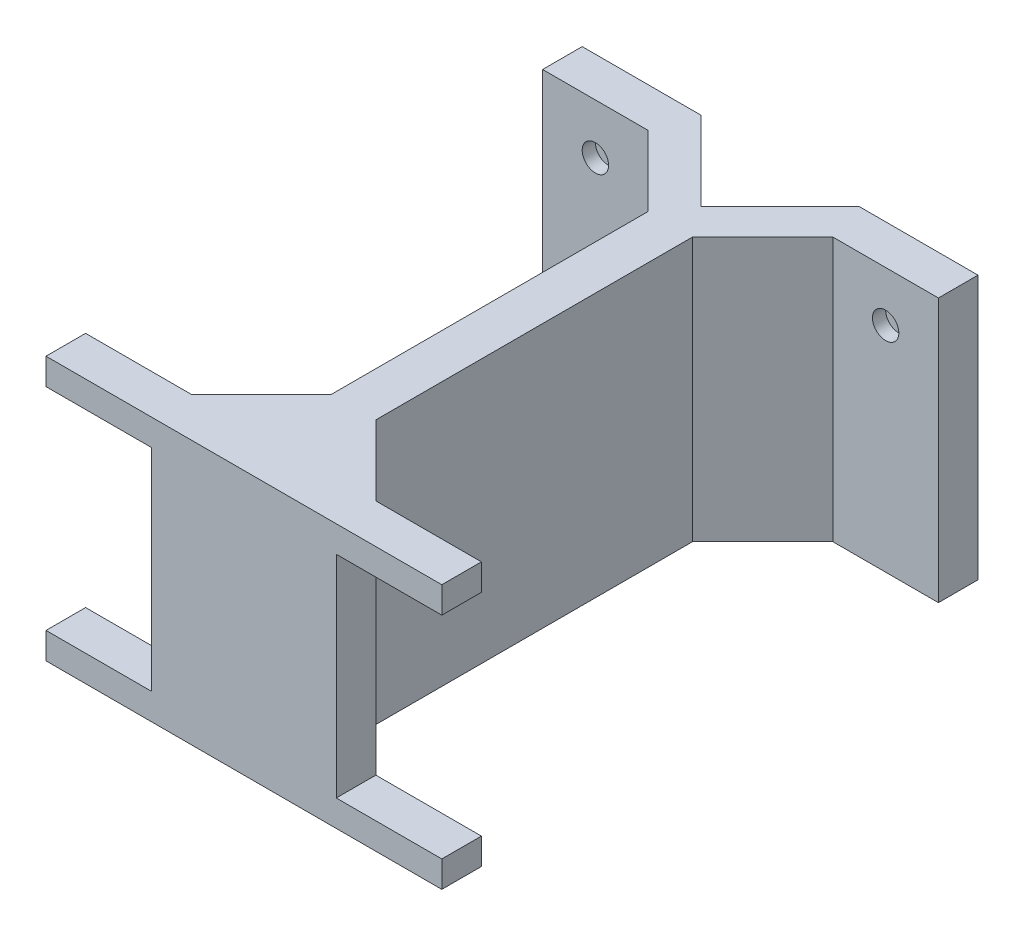
ISO-10303-21;
HEADER;
FILE_DESCRIPTION(('STEP AP214'),'2;1');
FILE_NAME('part.step','',(''),(''),'','','');
FILE_SCHEMA(('AUTOMOTIVE_DESIGN { 1 0 10303 214 1 1 1 1 }'));
ENDSEC;
DATA;
#1=APPLICATION_CONTEXT('core data for automotive mechanical design processes');
#2=APPLICATION_PROTOCOL_DEFINITION('international standard','automotive_design',2000,#1);
#3=PRODUCT_CONTEXT('',#1,'mechanical');
#4=PRODUCT('Part','Part','',(#3));
#5=PRODUCT_RELATED_PRODUCT_CATEGORY('part','',(#4));
#6=PRODUCT_DEFINITION_FORMATION('','',#4);
#7=PRODUCT_DEFINITION_CONTEXT('part definition',#1,'design');
#8=PRODUCT_DEFINITION('design','',#6,#7);
#9=PRODUCT_DEFINITION_SHAPE('','',#8);
#10=(LENGTH_UNIT() NAMED_UNIT(*) SI_UNIT(.MILLI.,.METRE.));
#11=(NAMED_UNIT(*) PLANE_ANGLE_UNIT() SI_UNIT($,.RADIAN.));
#12=(NAMED_UNIT(*) SI_UNIT($,.STERADIAN.) SOLID_ANGLE_UNIT());
#13=UNCERTAINTY_MEASURE_WITH_UNIT(LENGTH_MEASURE(1.E-05),#10,'distance_accuracy_value','');
#14=(GEOMETRIC_REPRESENTATION_CONTEXT(3) GLOBAL_UNCERTAINTY_ASSIGNED_CONTEXT((#13)) GLOBAL_UNIT_ASSIGNED_CONTEXT((#10,
#11,#12)) REPRESENTATION_CONTEXT('',''));
#15=CARTESIAN_POINT('',(0.,0.,0.));
#16=DIRECTION('',(0.,0.,1.));
#17=DIRECTION('',(1.,0.,0.));
#18=AXIS2_PLACEMENT_3D('',#15,#16,#17);
#19=CARTESIAN_POINT('',(0.,0.,0.));
#20=DIRECTION('',(0.,0.,1.));
#21=DIRECTION('',(1.,0.,0.));
#22=AXIS2_PLACEMENT_3D('',#19,#20,#21);
#23=PLANE('',#22);
#24=DIRECTION('',(1.,0.,0.));
#25=VECTOR('',#24,1.);
#26=CARTESIAN_POINT('',(-40.8076923076923,-31.8135302197802,0.));
#27=LINE('',#26,#25);
#28=CARTESIAN_POINT('',(11.632803864685,-31.8135302197802,0.));
#29=VERTEX_POINT('',#28);
#30=CARTESIAN_POINT('',(34.1923076923077,-31.8135302197802,0.));
#31=VERTEX_POINT('',#30);
#32=EDGE_CURVE('E461',#29,#31,#27,.T.);
#33=ORIENTED_EDGE('',*,*,#32,.F.);
#34=DIRECTION('',(0.,1.,0.));
#35=VECTOR('',#34,1.);
#36=CARTESIAN_POINT('',(11.632803864685,-31.8135302197802,0.));
#37=LINE('',#36,#35);
#38=CARTESIAN_POINT('',(11.632803864685,18.1864697802198,0.));
#39=VERTEX_POINT('',#38);
#40=EDGE_CURVE('E225',#29,#39,#37,.T.);
#41=ORIENTED_EDGE('',*,*,#40,.T.);
#42=DIRECTION('',(-1.,0.,0.));
#43=VECTOR('',#42,1.);
#44=CARTESIAN_POINT('',(-40.8076923076923,18.1864697802198,0.));
#45=LINE('',#44,#43);
#46=CARTESIAN_POINT('',(34.1923076923077,18.1864697802198,0.));
#47=VERTEX_POINT('',#46);
#48=EDGE_CURVE('E469',#47,#39,#45,.T.);
#49=ORIENTED_EDGE('',*,*,#48,.F.);
#50=DIRECTION('',(0.,1.,0.));
#51=VECTOR('',#50,1.);
#52=CARTESIAN_POINT('',(34.1923076923077,18.1864697802198,0.));
#53=LINE('',#52,#51);
#54=EDGE_CURVE('E464',#31,#47,#53,.T.);
#55=ORIENTED_EDGE('',*,*,#54,.F.);
#56=EDGE_LOOP('',(#33,#41,#49,#55));
#57=FACE_BOUND('',#56,.T.);
#58=ADVANCED_FACE('F39',(#57),#23,.F.);
#59=CARTESIAN_POINT('',(-40.8076923076923,18.1864697802198,101.6));
#60=DIRECTION('',(1.,0.,0.));
#61=DIRECTION('',(0.,1.,0.));
#62=AXIS2_PLACEMENT_3D('',#59,#60,#61);
#63=PLANE('',#62);
#64=DIRECTION('',(0.,1.,0.));
#65=VECTOR('',#64,1.);
#66=CARTESIAN_POINT('',(-40.8076923076923,-83.4135302197802,94.1));
#67=LINE('',#66,#65);
#68=CARTESIAN_POINT('',(-40.8076923076923,13.1864697802198,94.1));
#69=VERTEX_POINT('',#68);
#70=CARTESIAN_POINT('',(-40.8076923076923,18.1864697802198,94.1));
#71=VERTEX_POINT('',#70);
#72=EDGE_CURVE('E396',#69,#71,#67,.T.);
#73=ORIENTED_EDGE('',*,*,#72,.F.);
#74=DIRECTION('',(0.,0.,1.));
#75=VECTOR('',#74,1.);
#76=CARTESIAN_POINT('',(-40.8076923076923,13.1864697802198,91.6));
#77=LINE('',#76,#75);
#78=CARTESIAN_POINT('',(-40.8076923076923,13.1864697802198,101.6));
#79=VERTEX_POINT('',#78);
#80=EDGE_CURVE('E279',#69,#79,#77,.T.);
#81=ORIENTED_EDGE('',*,*,#80,.T.);
#82=DIRECTION('',(0.,-1.,0.));
#83=VECTOR('',#82,1.);
#84=CARTESIAN_POINT('',(-40.8076923076923,18.1864697802198,101.6));
#85=LINE('',#84,#83);
#86=CARTESIAN_POINT('',(-40.8076923076923,18.1864697802198,101.6));
#87=VERTEX_POINT('',#86);
#88=EDGE_CURVE('E441',#87,#79,#85,.T.);
#89=ORIENTED_EDGE('',*,*,#88,.F.);
#90=DIRECTION('',(0.,0.,-1.));
#91=VECTOR('',#90,1.);
#92=CARTESIAN_POINT('',(-40.8076923076923,18.1864697802198,101.6));
#93=LINE('',#92,#91);
#94=EDGE_CURVE('E473',#87,#71,#93,.T.);
#95=ORIENTED_EDGE('',*,*,#94,.T.);
#96=EDGE_LOOP('',(#73,#81,#89,#95));
#97=FACE_BOUND('',#96,.T.);
#98=ADVANCED_FACE('F611',(#97),#63,.F.);
#99=CARTESIAN_POINT('',(-20.8076923076923,-83.4135302197802,94.1));
#100=DIRECTION('',(0.,0.,1.));
#101=DIRECTION('',(1.,0.,0.));
#102=AXIS2_PLACEMENT_3D('',#99,#100,#101);
#103=PLANE('',#102);
#104=DIRECTION('',(0.,1.,0.));
#105=VECTOR('',#104,1.);
#106=CARTESIAN_POINT('',(-20.8076923076923,-83.4135302197802,94.1));
#107=LINE('',#106,#105);
#108=CARTESIAN_POINT('',(-20.8076923076923,13.1864697802198,94.1));
#109=VERTEX_POINT('',#108);
#110=CARTESIAN_POINT('',(-20.8076923076923,18.1864697802198,94.1));
#111=VERTEX_POINT('',#110);
#112=EDGE_CURVE('E416',#109,#111,#107,.T.);
#113=ORIENTED_EDGE('',*,*,#112,.F.);
#114=DIRECTION('',(-1.,0.,0.));
#115=VECTOR('',#114,1.);
#116=CARTESIAN_POINT('',(-20.8076923076923,13.1864697802198,94.1));
#117=LINE('',#116,#115);
#118=EDGE_CURVE('E11',#109,#69,#117,.T.);
#119=ORIENTED_EDGE('',*,*,#118,.T.);
#120=ORIENTED_EDGE('',*,*,#72,.T.);
#121=DIRECTION('',(1.,0.,0.));
#122=VECTOR('',#121,1.);
#123=CARTESIAN_POINT('',(-20.8076923076923,18.1864697802198,94.1));
#124=LINE('',#123,#122);
#125=EDGE_CURVE('E377',#71,#111,#124,.T.);
#126=ORIENTED_EDGE('',*,*,#125,.T.);
#127=EDGE_LOOP('',(#113,#119,#120,#126));
#128=FACE_BOUND('',#127,.T.);
#129=ADVANCED_FACE('F530',(#128),#103,.F.);
#130=CARTESIAN_POINT('',(34.1923076923077,18.1864697802198,101.6));
#131=DIRECTION('',(-1.,0.,0.));
#132=DIRECTION('',(0.,-1.,0.));
#133=AXIS2_PLACEMENT_3D('',#130,#131,#132);
#134=PLANE('',#133);
#135=DIRECTION('',(0.,1.,0.));
#136=VECTOR('',#135,1.);
#137=CARTESIAN_POINT('',(34.1923076923077,-83.4135302197802,94.1));
#138=LINE('',#137,#136);
#139=CARTESIAN_POINT('',(34.1923076923077,-31.8135302197802,94.1));
#140=VERTEX_POINT('',#139);
#141=CARTESIAN_POINT('',(34.1923076923077,-26.8135302197802,94.1));
#142=VERTEX_POINT('',#141);
#143=EDGE_CURVE('E335',#140,#142,#138,.T.);
#144=ORIENTED_EDGE('',*,*,#143,.T.);
#145=DIRECTION('',(0.,0.,1.));
#146=VECTOR('',#145,1.);
#147=CARTESIAN_POINT('',(34.1923076923077,-26.8135302197802,91.6));
#148=LINE('',#147,#146);
#149=CARTESIAN_POINT('',(34.1923076923077,-26.8135302197802,101.6));
#150=VERTEX_POINT('',#149);
#151=EDGE_CURVE('E302',#142,#150,#148,.T.);
#152=ORIENTED_EDGE('',*,*,#151,.T.);
#153=DIRECTION('',(0.,1.,0.));
#154=VECTOR('',#153,1.);
#155=CARTESIAN_POINT('',(34.1923076923077,18.1864697802198,101.6));
#156=LINE('',#155,#154);
#157=CARTESIAN_POINT('',(34.1923076923077,-31.8135302197802,101.6));
#158=VERTEX_POINT('',#157);
#159=EDGE_CURVE('E450',#158,#150,#156,.T.);
#160=ORIENTED_EDGE('',*,*,#159,.F.);
#161=DIRECTION('',(0.,0.,-1.));
#162=VECTOR('',#161,1.);
#163=CARTESIAN_POINT('',(34.1923076923077,-31.8135302197802,101.6));
#164=LINE('',#163,#162);
#165=EDGE_CURVE('E483',#158,#140,#164,.T.);
#166=ORIENTED_EDGE('',*,*,#165,.T.);
#167=EDGE_LOOP('',(#144,#152,#160,#166));
#168=FACE_BOUND('',#167,.T.);
#169=ADVANCED_FACE('F590',(#168),#134,.F.);
#170=CARTESIAN_POINT('',(34.1923076923077,-83.4135302197802,94.1));
#171=DIRECTION('',(0.,0.,1.));
#172=DIRECTION('',(1.,0.,0.));
#173=AXIS2_PLACEMENT_3D('',#170,#171,#172);
#174=PLANE('',#173);
#175=DIRECTION('',(0.,1.,0.));
#176=VECTOR('',#175,1.);
#177=CARTESIAN_POINT('',(14.1923076923077,-83.4135302197802,94.1));
#178=LINE('',#177,#176);
#179=CARTESIAN_POINT('',(14.1923076923077,-31.8135302197802,94.1));
#180=VERTEX_POINT('',#179);
#181=CARTESIAN_POINT('',(14.1923076923077,-26.8135302197802,94.1));
#182=VERTEX_POINT('',#181);
#183=EDGE_CURVE('E341',#180,#182,#178,.T.);
#184=ORIENTED_EDGE('',*,*,#183,.T.);
#185=DIRECTION('',(1.,0.,0.));
#186=VECTOR('',#185,1.);
#187=CARTESIAN_POINT('',(34.1923076923077,-26.8135302197802,94.1));
#188=LINE('',#187,#186);
#189=EDGE_CURVE('E496',#182,#142,#188,.T.);
#190=ORIENTED_EDGE('',*,*,#189,.T.);
#191=ORIENTED_EDGE('',*,*,#143,.F.);
#192=DIRECTION('',(1.,0.,0.));
#193=VECTOR('',#192,1.);
#194=CARTESIAN_POINT('',(-40.8076923076923,-31.8135302197802,94.1000000000001));
#195=LINE('',#194,#193);
#196=EDGE_CURVE('E373',#180,#140,#195,.T.);
#197=ORIENTED_EDGE('',*,*,#196,.F.);
#198=EDGE_LOOP('',(#184,#190,#191,#197));
#199=FACE_BOUND('',#198,.T.);
#200=ADVANCED_FACE('F666',(#199),#174,.F.);
#201=CARTESIAN_POINT('',(34.1923076923077,13.1864697802198,101.6));
#202=VERTEX_POINT('',#201);
#203=CARTESIAN_POINT('',(34.1923076923077,18.1864697802198,101.6));
#204=VERTEX_POINT('',#203);
#205=EDGE_CURVE('E449',#202,#204,#156,.T.);
#206=ORIENTED_EDGE('',*,*,#205,.F.);
#207=DIRECTION('',(0.,0.,1.));
#208=VECTOR('',#207,1.);
#209=CARTESIAN_POINT('',(34.1923076923077,13.1864697802198,91.6));
#210=LINE('',#209,#208);
#211=CARTESIAN_POINT('',(34.1923076923077,13.1864697802198,94.1));
#212=VERTEX_POINT('',#211);
#213=EDGE_CURVE('E301',#212,#202,#210,.T.);
#214=ORIENTED_EDGE('',*,*,#213,.F.);
#215=CARTESIAN_POINT('',(34.1923076923077,18.1864697802198,94.1));
#216=VERTEX_POINT('',#215);
#217=EDGE_CURVE('E340',#212,#216,#138,.T.);
#218=ORIENTED_EDGE('',*,*,#217,.T.);
#219=DIRECTION('',(0.,0.,-1.));
#220=VECTOR('',#219,1.);
#221=CARTESIAN_POINT('',(34.1923076923077,18.1864697802198,101.6));
#222=LINE('',#221,#220);
#223=EDGE_CURVE('E478',#204,#216,#222,.T.);
#224=ORIENTED_EDGE('',*,*,#223,.F.);
#225=EDGE_LOOP('',(#206,#214,#218,#224));
#226=FACE_BOUND('',#225,.T.);
#227=ADVANCED_FACE('F606',(#226),#134,.F.);
#228=DIRECTION('',(0.,0.,-1.));
#229=VECTOR('',#228,1.);
#230=CARTESIAN_POINT('',(-40.8076923076923,-31.8135302197802,101.6));
#231=LINE('',#230,#229);
#232=CARTESIAN_POINT('',(-40.8076923076923,-31.8135302197802,7.50000000000001));
#233=VERTEX_POINT('',#232);
#234=CARTESIAN_POINT('',(-40.8076923076923,-31.8135302197802,0.));
#235=VERTEX_POINT('',#234);
#236=EDGE_CURVE('E487',#233,#235,#231,.T.);
#237=ORIENTED_EDGE('',*,*,#236,.F.);
#238=DIRECTION('',(0.,1.,0.));
#239=VECTOR('',#238,1.);
#240=CARTESIAN_POINT('',(-40.8076923076923,-83.4135302197802,7.50000000000001));
#241=LINE('',#240,#239);
#242=CARTESIAN_POINT('',(-40.8076923076923,18.1864697802198,7.50000000000001));
#243=VERTEX_POINT('',#242);
#244=EDGE_CURVE('E397',#233,#243,#241,.T.);
#245=ORIENTED_EDGE('',*,*,#244,.T.);
#246=CARTESIAN_POINT('',(-40.8076923076923,18.1864697802198,0.));
#247=VERTEX_POINT('',#246);
#248=EDGE_CURVE('E457',#243,#247,#93,.T.);
#249=ORIENTED_EDGE('',*,*,#248,.T.);
#250=DIRECTION('',(0.,-1.,0.));
#251=VECTOR('',#250,1.);
#252=CARTESIAN_POINT('',(-40.8076923076923,18.1864697802198,0.));
#253=LINE('',#252,#251);
#254=EDGE_CURVE('E440',#247,#235,#253,.T.);
#255=ORIENTED_EDGE('',*,*,#254,.T.);
#256=EDGE_LOOP('',(#237,#245,#249,#255));
#257=FACE_BOUND('',#256,.T.);
#258=ADVANCED_FACE('F546',(#257),#63,.F.);
#259=CARTESIAN_POINT('',(-40.8076923076923,-26.8135302197802,101.6));
#260=VERTEX_POINT('',#259);
#261=CARTESIAN_POINT('',(-40.8076923076923,-31.8135302197802,101.6));
#262=VERTEX_POINT('',#261);
#263=EDGE_CURVE('E446',#260,#262,#85,.T.);
#264=ORIENTED_EDGE('',*,*,#263,.F.);
#265=DIRECTION('',(0.,0.,1.));
#266=VECTOR('',#265,1.);
#267=CARTESIAN_POINT('',(-40.8076923076923,-26.8135302197802,91.6));
#268=LINE('',#267,#266);
#269=CARTESIAN_POINT('',(-40.8076923076923,-26.8135302197802,94.1));
#270=VERTEX_POINT('',#269);
#271=EDGE_CURVE('E278',#270,#260,#268,.T.);
#272=ORIENTED_EDGE('',*,*,#271,.F.);
#273=CARTESIAN_POINT('',(-40.8076923076923,-31.8135302197802,94.1));
#274=VERTEX_POINT('',#273);
#275=EDGE_CURVE('E417',#274,#270,#67,.T.);
#276=ORIENTED_EDGE('',*,*,#275,.F.);
#277=EDGE_CURVE('E488',#262,#274,#231,.T.);
#278=ORIENTED_EDGE('',*,*,#277,.F.);
#279=EDGE_LOOP('',(#264,#272,#276,#278));
#280=FACE_BOUND('',#279,.T.);
#281=ADVANCED_FACE('F41',(#280),#63,.F.);
#282=CARTESIAN_POINT('',(-40.8076923076923,-31.8135302197802,101.6));
#283=DIRECTION('',(0.,1.,0.));
#284=DIRECTION('',(0.,0.,1.));
#285=AXIS2_PLACEMENT_3D('',#282,#283,#284);
#286=PLANE('',#285);
#287=DIRECTION('',(0.707106781186548,0.,0.707106781186548));
#288=VECTOR('',#287,1.);
#289=CARTESIAN_POINT('',(-18.2481884800696,-31.8135302197802,0.));
#290=LINE('',#289,#288);
#291=CARTESIAN_POINT('',(-18.2481884800696,-31.8135302197802,0.));
#292=VERTEX_POINT('',#291);
#293=CARTESIAN_POINT('',(-3.3076923076923,-31.8135302197802,14.9404961723773));
#294=VERTEX_POINT('',#293);
#295=EDGE_CURVE('E55',#292,#294,#290,.T.);
#296=ORIENTED_EDGE('',*,*,#295,.T.);
#297=DIRECTION('',(0.707106781186547,0.,-0.707106781186548));
#298=VECTOR('',#297,1.);
#299=CARTESIAN_POINT('',(-3.3076923076923,-31.8135302197802,14.9404961723773));
#300=LINE('',#299,#298);
#301=EDGE_CURVE('E229',#294,#29,#300,.T.);
#302=ORIENTED_EDGE('',*,*,#301,.T.);
#303=ORIENTED_EDGE('',*,*,#32,.T.);
#304=CARTESIAN_POINT('',(34.1923076923077,-31.8135302197802,7.50000000000001));
#305=VERTEX_POINT('',#304);
#306=EDGE_CURVE('E482',#305,#31,#164,.T.);
#307=ORIENTED_EDGE('',*,*,#306,.F.);
#308=DIRECTION('',(-1.,0.,0.));
#309=VECTOR('',#308,1.);
#310=CARTESIAN_POINT('',(-40.8076923076923,-31.8135302197802,7.49999999999999));
#311=LINE('',#310,#309);
#312=CARTESIAN_POINT('',(14.1923076923077,-31.8135302197802,7.5));
#313=VERTEX_POINT('',#312);
#314=EDGE_CURVE('E339',#305,#313,#311,.T.);
#315=ORIENTED_EDGE('',*,*,#314,.T.);
#316=DIRECTION('',(-0.707106781186546,0.,0.707106781186549));
#317=VECTOR('',#316,1.);
#318=CARTESIAN_POINT('',(-60.3576923076922,-31.8135302197802,82.0500000000002));
#319=LINE('',#318,#317);
#320=CARTESIAN_POINT('',(0.892307692307742,-31.8135302197802,20.8));
#321=VERTEX_POINT('',#320);
#322=EDGE_CURVE('E361',#313,#321,#319,.T.);
#323=ORIENTED_EDGE('',*,*,#322,.T.);
#324=DIRECTION('',(0.,0.,1.));
#325=VECTOR('',#324,1.);
#326=CARTESIAN_POINT('',(0.892307692307741,-31.8135302197802,101.6));
#327=LINE('',#326,#325);
#328=CARTESIAN_POINT('',(0.892307692307742,-31.8135302197802,80.8));
#329=VERTEX_POINT('',#328);
#330=EDGE_CURVE('E365',#321,#329,#327,.T.);
#331=ORIENTED_EDGE('',*,*,#330,.T.);
#332=DIRECTION('',(0.707106781186547,0.,0.707106781186549));
#333=VECTOR('',#332,1.);
#334=CARTESIAN_POINT('',(-9.55769230769222,-31.8135302197802,70.35));
#335=LINE('',#334,#333);
#336=EDGE_CURVE('E369',#329,#180,#335,.T.);
#337=ORIENTED_EDGE('',*,*,#336,.T.);
#338=ORIENTED_EDGE('',*,*,#196,.T.);
#339=ORIENTED_EDGE('',*,*,#165,.F.);
#340=DIRECTION('',(1.,0.,0.));
#341=VECTOR('',#340,1.);
#342=CARTESIAN_POINT('',(-40.8076923076923,-31.8135302197802,101.6));
#343=LINE('',#342,#341);
#344=EDGE_CURVE('E445',#262,#158,#343,.T.);
#345=ORIENTED_EDGE('',*,*,#344,.F.);
#346=ORIENTED_EDGE('',*,*,#277,.T.);
#347=DIRECTION('',(1.,0.,0.));
#348=VECTOR('',#347,1.);
#349=CARTESIAN_POINT('',(-40.8076923076923,-31.8135302197802,94.1));
#350=LINE('',#349,#348);
#351=CARTESIAN_POINT('',(-20.8076923076923,-31.8135302197802,94.1));
#352=VERTEX_POINT('',#351);
#353=EDGE_CURVE('E401',#274,#352,#350,.T.);
#354=ORIENTED_EDGE('',*,*,#353,.T.);
#355=DIRECTION('',(0.707106781186545,0.,-0.70710678118655));
#356=VECTOR('',#355,1.);
#357=CARTESIAN_POINT('',(-34.5576923076922,-31.8135302197802,107.85));
#358=LINE('',#357,#356);
#359=CARTESIAN_POINT('',(-7.50769230769244,-31.8135302197802,80.8));
#360=VERTEX_POINT('',#359);
#361=EDGE_CURVE('E424',#352,#360,#358,.T.);
#362=ORIENTED_EDGE('',*,*,#361,.T.);
#363=DIRECTION('',(0.,0.,-1.));
#364=VECTOR('',#363,1.);
#365=CARTESIAN_POINT('',(-7.50769230769244,-31.8135302197802,101.6));
#366=LINE('',#365,#364);
#367=CARTESIAN_POINT('',(-7.50769230769245,-31.8135302197802,20.8));
#368=VERTEX_POINT('',#367);
#369=EDGE_CURVE('E428',#360,#368,#366,.T.);
#370=ORIENTED_EDGE('',*,*,#369,.T.);
#371=DIRECTION('',(-0.707106781186542,0.,-0.707106781186553));
#372=VECTOR('',#371,1.);
#373=CARTESIAN_POINT('',(16.2423076923078,-31.8135302197802,44.5500000000007));
#374=LINE('',#373,#372);
#375=CARTESIAN_POINT('',(-20.8076923076923,-31.8135302197802,7.5));
#376=VERTEX_POINT('',#375);
#377=EDGE_CURVE('E432',#368,#376,#374,.T.);
#378=ORIENTED_EDGE('',*,*,#377,.T.);
#379=DIRECTION('',(-1.,0.,0.));
#380=VECTOR('',#379,1.);
#381=CARTESIAN_POINT('',(-40.8076923076923,-31.8135302197802,7.50000000000001));
#382=LINE('',#381,#380);
#383=EDGE_CURVE('E436',#376,#233,#382,.T.);
#384=ORIENTED_EDGE('',*,*,#383,.T.);
#385=ORIENTED_EDGE('',*,*,#236,.T.);
#386=EDGE_CURVE('E239',#235,#292,#27,.T.);
#387=ORIENTED_EDGE('',*,*,#386,.T.);
#388=EDGE_LOOP('',(#296,#302,#303,#307,#315,#323,#331,#337,#338,#339,#345,#346,#354,#362,#370,
#378,#384,#385,#387));
#389=FACE_BOUND('',#388,.T.);
#390=ADVANCED_FACE('F237',(#389),#286,.F.);
#391=CARTESIAN_POINT('',(34.1923076923077,18.1864697802198,7.50000000000001));
#392=VERTEX_POINT('',#391);
#393=EDGE_CURVE('E477',#392,#47,#222,.T.);
#394=ORIENTED_EDGE('',*,*,#393,.F.);
#395=DIRECTION('',(0.,1.,0.));
#396=VECTOR('',#395,1.);
#397=CARTESIAN_POINT('',(34.1923076923077,-83.4135302197802,7.50000000000001));
#398=LINE('',#397,#396);
#399=EDGE_CURVE('E334',#305,#392,#398,.T.);
#400=ORIENTED_EDGE('',*,*,#399,.F.);
#401=ORIENTED_EDGE('',*,*,#306,.T.);
#402=ORIENTED_EDGE('',*,*,#54,.T.);
#403=EDGE_LOOP('',(#394,#400,#401,#402));
#404=FACE_BOUND('',#403,.T.);
#405=ADVANCED_FACE('F565',(#404),#134,.F.);
#406=CARTESIAN_POINT('',(-40.8076923076923,18.1864697802198,101.6));
#407=DIRECTION('',(0.,-1.,0.));
#408=DIRECTION('',(0.,0.,-1.));
#409=AXIS2_PLACEMENT_3D('',#406,#407,#408);
#410=PLANE('',#409);
#411=ORIENTED_EDGE('',*,*,#48,.T.);
#412=DIRECTION('',(0.707106781186547,0.,-0.707106781186548));
#413=VECTOR('',#412,1.);
#414=CARTESIAN_POINT('',(-3.3076923076923,18.1864697802198,14.9404961723773));
#415=LINE('',#414,#413);
#416=CARTESIAN_POINT('',(-3.3076923076923,18.1864697802198,14.9404961723773));
#417=VERTEX_POINT('',#416);
#418=EDGE_CURVE('E241',#417,#39,#415,.T.);
#419=ORIENTED_EDGE('',*,*,#418,.F.);
#420=DIRECTION('',(0.707106781186548,0.,0.707106781186548));
#421=VECTOR('',#420,1.);
#422=CARTESIAN_POINT('',(-18.2481884800696,18.1864697802198,0.));
#423=LINE('',#422,#421);
#424=CARTESIAN_POINT('',(-18.2481884800696,18.1864697802198,0.));
#425=VERTEX_POINT('',#424);
#426=EDGE_CURVE('E221',#425,#417,#423,.T.);
#427=ORIENTED_EDGE('',*,*,#426,.F.);
#428=EDGE_CURVE('E468',#425,#247,#45,.T.);
#429=ORIENTED_EDGE('',*,*,#428,.T.);
#430=ORIENTED_EDGE('',*,*,#248,.F.);
#431=DIRECTION('',(-1.,0.,0.));
#432=VECTOR('',#431,1.);
#433=CARTESIAN_POINT('',(-40.8076923076923,18.1864697802198,7.50000000000001));
#434=LINE('',#433,#432);
#435=CARTESIAN_POINT('',(-20.8076923076923,18.1864697802198,7.5));
#436=VERTEX_POINT('',#435);
#437=EDGE_CURVE('E393',#436,#243,#434,.T.);
#438=ORIENTED_EDGE('',*,*,#437,.F.);
#439=DIRECTION('',(-0.707106781186542,0.,-0.707106781186553));
#440=VECTOR('',#439,1.);
#441=CARTESIAN_POINT('',(-20.8076923076923,18.1864697802198,7.5));
#442=LINE('',#441,#440);
#443=CARTESIAN_POINT('',(-7.50769230769245,18.1864697802198,20.8));
#444=VERTEX_POINT('',#443);
#445=EDGE_CURVE('E389',#444,#436,#442,.T.);
#446=ORIENTED_EDGE('',*,*,#445,.F.);
#447=DIRECTION('',(0.,0.,-1.));
#448=VECTOR('',#447,1.);
#449=CARTESIAN_POINT('',(-7.50769230769245,18.1864697802198,20.8));
#450=LINE('',#449,#448);
#451=CARTESIAN_POINT('',(-7.50769230769244,18.1864697802198,80.8));
#452=VERTEX_POINT('',#451);
#453=EDGE_CURVE('E385',#452,#444,#450,.T.);
#454=ORIENTED_EDGE('',*,*,#453,.F.);
#455=DIRECTION('',(0.707106781186545,0.,-0.70710678118655));
#456=VECTOR('',#455,1.);
#457=CARTESIAN_POINT('',(-7.50769230769244,18.1864697802198,80.8));
#458=LINE('',#457,#456);
#459=EDGE_CURVE('E381',#111,#452,#458,.T.);
#460=ORIENTED_EDGE('',*,*,#459,.F.);
#461=ORIENTED_EDGE('',*,*,#125,.F.);
#462=ORIENTED_EDGE('',*,*,#94,.F.);
#463=DIRECTION('',(-1.,0.,0.));
#464=VECTOR('',#463,1.);
#465=CARTESIAN_POINT('',(-40.8076923076923,18.1864697802198,101.6));
#466=LINE('',#465,#464);
#467=EDGE_CURVE('E454',#204,#87,#466,.T.);
#468=ORIENTED_EDGE('',*,*,#467,.F.);
#469=ORIENTED_EDGE('',*,*,#223,.T.);
#470=DIRECTION('',(1.,0.,0.));
#471=VECTOR('',#470,1.);
#472=CARTESIAN_POINT('',(34.1923076923077,18.1864697802198,94.1));
#473=LINE('',#472,#471);
#474=CARTESIAN_POINT('',(14.1923076923077,18.1864697802198,94.1));
#475=VERTEX_POINT('',#474);
#476=EDGE_CURVE('E330',#475,#216,#473,.T.);
#477=ORIENTED_EDGE('',*,*,#476,.F.);
#478=DIRECTION('',(0.707106781186546,0.,0.707106781186549));
#479=VECTOR('',#478,1.);
#480=CARTESIAN_POINT('',(14.1923076923077,18.1864697802198,94.1));
#481=LINE('',#480,#479);
#482=CARTESIAN_POINT('',(0.892307692307742,18.1864697802198,80.8));
#483=VERTEX_POINT('',#482);
#484=EDGE_CURVE('E326',#483,#475,#481,.T.);
#485=ORIENTED_EDGE('',*,*,#484,.F.);
#486=DIRECTION('',(0.,0.,1.));
#487=VECTOR('',#486,1.);
#488=CARTESIAN_POINT('',(0.892307692307742,18.1864697802198,80.8));
#489=LINE('',#488,#487);
#490=CARTESIAN_POINT('',(0.892307692307742,18.1864697802198,20.8));
#491=VERTEX_POINT('',#490);
#492=EDGE_CURVE('E322',#491,#483,#489,.T.);
#493=ORIENTED_EDGE('',*,*,#492,.F.);
#494=DIRECTION('',(-0.707106781186546,0.,0.707106781186549));
#495=VECTOR('',#494,1.);
#496=CARTESIAN_POINT('',(0.892307692307742,18.1864697802198,20.8));
#497=LINE('',#496,#495);
#498=CARTESIAN_POINT('',(14.1923076923077,18.1864697802198,7.5));
#499=VERTEX_POINT('',#498);
#500=EDGE_CURVE('E318',#499,#491,#497,.T.);
#501=ORIENTED_EDGE('',*,*,#500,.F.);
#502=DIRECTION('',(-1.,0.,0.));
#503=VECTOR('',#502,1.);
#504=CARTESIAN_POINT('',(14.1923076923077,18.1864697802198,7.5));
#505=LINE('',#504,#503);
#506=EDGE_CURVE('E306',#392,#499,#505,.T.);
#507=ORIENTED_EDGE('',*,*,#506,.F.);
#508=ORIENTED_EDGE('',*,*,#393,.T.);
#509=EDGE_LOOP('',(#411,#419,#427,#429,#430,#438,#446,#454,#460,#461,#462,#468,#469,#477,#485,
#493,#501,#507,#508));
#510=FACE_BOUND('',#509,.T.);
#511=ADVANCED_FACE('F534',(#510),#410,.F.);
#512=CARTESIAN_POINT('',(0.,0.,101.6));
#513=DIRECTION('',(0.,0.,1.));
#514=DIRECTION('',(1.,0.,0.));
#515=AXIS2_PLACEMENT_3D('',#512,#513,#514);
#516=PLANE('',#515);
#517=DIRECTION('',(-1.,0.,0.));
#518=VECTOR('',#517,1.);
#519=CARTESIAN_POINT('',(-40.8076923076923,13.1864697802198,101.6));
#520=LINE('',#519,#518);
#521=CARTESIAN_POINT('',(-20.8076923076923,13.1864697802198,101.6));
#522=VERTEX_POINT('',#521);
#523=EDGE_CURVE('E275',#522,#79,#520,.T.);
#524=ORIENTED_EDGE('',*,*,#523,.F.);
#525=DIRECTION('',(0.,1.,0.));
#526=VECTOR('',#525,1.);
#527=CARTESIAN_POINT('',(-20.8076923076923,13.1864697802198,101.6));
#528=LINE('',#527,#526);
#529=CARTESIAN_POINT('',(-20.8076923076923,-26.8135302197802,101.6));
#530=VERTEX_POINT('',#529);
#531=EDGE_CURVE('E271',#530,#522,#528,.T.);
#532=ORIENTED_EDGE('',*,*,#531,.F.);
#533=DIRECTION('',(1.,0.,0.));
#534=VECTOR('',#533,1.);
#535=CARTESIAN_POINT('',(-40.8076923076923,-26.8135302197802,101.6));
#536=LINE('',#535,#534);
#537=EDGE_CURVE('E265',#260,#530,#536,.T.);
#538=ORIENTED_EDGE('',*,*,#537,.F.);
#539=ORIENTED_EDGE('',*,*,#263,.T.);
#540=ORIENTED_EDGE('',*,*,#344,.T.);
#541=ORIENTED_EDGE('',*,*,#159,.T.);
#542=DIRECTION('',(1.,0.,0.));
#543=VECTOR('',#542,1.);
#544=CARTESIAN_POINT('',(34.1923076923077,-26.8135302197802,101.6));
#545=LINE('',#544,#543);
#546=CARTESIAN_POINT('',(14.1923076923077,-26.8135302197802,101.6));
#547=VERTEX_POINT('',#546);
#548=EDGE_CURVE('E298',#547,#150,#545,.T.);
#549=ORIENTED_EDGE('',*,*,#548,.F.);
#550=DIRECTION('',(0.,-1.,0.));
#551=VECTOR('',#550,1.);
#552=CARTESIAN_POINT('',(14.1923076923077,-26.8135302197802,101.6));
#553=LINE('',#552,#551);
#554=CARTESIAN_POINT('',(14.1923076923077,13.1864697802198,101.6));
#555=VERTEX_POINT('',#554);
#556=EDGE_CURVE('E294',#555,#547,#553,.T.);
#557=ORIENTED_EDGE('',*,*,#556,.F.);
#558=DIRECTION('',(-1.,0.,0.));
#559=VECTOR('',#558,1.);
#560=CARTESIAN_POINT('',(34.1923076923077,13.1864697802198,101.6));
#561=LINE('',#560,#559);
#562=EDGE_CURVE('E283',#202,#555,#561,.T.);
#563=ORIENTED_EDGE('',*,*,#562,.F.);
#564=ORIENTED_EDGE('',*,*,#205,.T.);
#565=ORIENTED_EDGE('',*,*,#467,.T.);
#566=ORIENTED_EDGE('',*,*,#88,.T.);
#567=EDGE_LOOP('',(#524,#532,#538,#539,#540,#541,#549,#557,#563,#564,#565,#566));
#568=FACE_BOUND('',#567,.T.);
#569=ADVANCED_FACE('F519',(#568),#516,.T.);
#570=ORIENTED_EDGE('',*,*,#428,.F.);
#571=DIRECTION('',(0.,1.,0.));
#572=VECTOR('',#571,1.);
#573=CARTESIAN_POINT('',(-18.2481884800696,-31.8135302197802,0.));
#574=LINE('',#573,#572);
#575=EDGE_CURVE('E226',#292,#425,#574,.T.);
#576=ORIENTED_EDGE('',*,*,#575,.F.);
#577=ORIENTED_EDGE('',*,*,#386,.F.);
#578=ORIENTED_EDGE('',*,*,#254,.F.);
#579=EDGE_LOOP('',(#570,#576,#577,#578));
#580=FACE_BOUND('',#579,.T.);
#581=ADVANCED_FACE('F625',(#580),#23,.F.);
#582=CARTESIAN_POINT('',(-40.8076923076923,-83.4135302197802,7.50000000000001));
#583=DIRECTION('',(0.,0.,-1.));
#584=DIRECTION('',(-1.,0.,0.));
#585=AXIS2_PLACEMENT_3D('',#582,#583,#584);
#586=PLANE('',#585);
#587=CARTESIAN_POINT('',(-30.8076923076923,8.68646978021977,7.49999999999999));
#588=DIRECTION('',(0.,0.,1.));
#589=DIRECTION('',(1.,0.,0.));
#590=AXIS2_PLACEMENT_3D('',#587,#588,#589);
#591=CIRCLE('',#590,2.5);
#592=CARTESIAN_POINT('',(-28.3076923076923,8.68646978021977,7.49999999999999));
#593=VERTEX_POINT('',#592);
#594=EDGE_CURVE('E249',#593,#593,#591,.T.);
#595=ORIENTED_EDGE('',*,*,#594,.F.);
#596=EDGE_LOOP('',(#595));
#597=FACE_BOUND('',#596,.T.);
#598=DIRECTION('',(0.,1.,0.));
#599=VECTOR('',#598,1.);
#600=CARTESIAN_POINT('',(-20.8076923076923,-83.4135302197802,7.5));
#601=LINE('',#600,#599);
#602=EDGE_CURVE('E402',#376,#436,#601,.T.);
#603=ORIENTED_EDGE('',*,*,#602,.T.);
#604=ORIENTED_EDGE('',*,*,#437,.T.);
#605=ORIENTED_EDGE('',*,*,#244,.F.);
#606=ORIENTED_EDGE('',*,*,#383,.F.);
#607=EDGE_LOOP('',(#603,#604,#605,#606));
#608=FACE_BOUND('',#607,.T.);
#609=ADVANCED_FACE('F632',(#597,#608),#586,.F.);
#610=CARTESIAN_POINT('',(-20.8076923076923,-83.4135302197802,7.5));
#611=DIRECTION('',(0.707106781186553,0.,-0.707106781186542));
#612=DIRECTION('',(-0.707106781186542,0.,-0.707106781186553));
#613=AXIS2_PLACEMENT_3D('',#610,#611,#612);
#614=PLANE('',#613);
#615=DIRECTION('',(0.,1.,0.));
#616=VECTOR('',#615,1.);
#617=CARTESIAN_POINT('',(-7.50769230769245,-83.4135302197802,20.8));
#618=LINE('',#617,#616);
#619=EDGE_CURVE('E405',#368,#444,#618,.T.);
#620=ORIENTED_EDGE('',*,*,#619,.T.);
#621=ORIENTED_EDGE('',*,*,#445,.T.);
#622=ORIENTED_EDGE('',*,*,#602,.F.);
#623=ORIENTED_EDGE('',*,*,#377,.F.);
#624=EDGE_LOOP('',(#620,#621,#622,#623));
#625=FACE_BOUND('',#624,.T.);
#626=ADVANCED_FACE('F541',(#625),#614,.F.);
#627=CARTESIAN_POINT('',(-7.50769230769245,-83.4135302197802,20.8));
#628=DIRECTION('',(1.,0.,0.));
#629=DIRECTION('',(0.,0.,-1.));
#630=AXIS2_PLACEMENT_3D('',#627,#628,#629);
#631=PLANE('',#630);
#632=DIRECTION('',(0.,1.,0.));
#633=VECTOR('',#632,1.);
#634=CARTESIAN_POINT('',(-7.50769230769244,-83.4135302197802,80.8));
#635=LINE('',#634,#633);
#636=EDGE_CURVE('E408',#360,#452,#635,.T.);
#637=ORIENTED_EDGE('',*,*,#636,.T.);
#638=ORIENTED_EDGE('',*,*,#453,.T.);
#639=ORIENTED_EDGE('',*,*,#619,.F.);
#640=ORIENTED_EDGE('',*,*,#369,.F.);
#641=EDGE_LOOP('',(#637,#638,#639,#640));
#642=FACE_BOUND('',#641,.T.);
#643=ADVANCED_FACE('F539',(#642),#631,.F.);
#644=CARTESIAN_POINT('',(-7.50769230769244,-83.4135302197802,80.8));
#645=DIRECTION('',(0.70710678118655,0.,0.707106781186545));
#646=DIRECTION('',(0.707106781186545,0.,-0.70710678118655));
#647=AXIS2_PLACEMENT_3D('',#644,#645,#646);
#648=PLANE('',#647);
#649=CARTESIAN_POINT('',(-20.8076923076923,-26.8135302197802,94.1));
#650=VERTEX_POINT('',#649);
#651=EDGE_CURVE('E411',#352,#650,#107,.T.);
#652=ORIENTED_EDGE('',*,*,#651,.T.);
#653=EDGE_CURVE('E415',#650,#109,#107,.T.);
#654=ORIENTED_EDGE('',*,*,#653,.T.);
#655=ORIENTED_EDGE('',*,*,#112,.T.);
#656=ORIENTED_EDGE('',*,*,#459,.T.);
#657=ORIENTED_EDGE('',*,*,#636,.F.);
#658=ORIENTED_EDGE('',*,*,#361,.F.);
#659=EDGE_LOOP('',(#652,#654,#655,#656,#657,#658));
#660=FACE_BOUND('',#659,.T.);
#661=ADVANCED_FACE('F508',(#660),#648,.F.);
#662=ORIENTED_EDGE('',*,*,#275,.T.);
#663=DIRECTION('',(1.,0.,0.));
#664=VECTOR('',#663,1.);
#665=CARTESIAN_POINT('',(-20.8076923076923,-26.8135302197802,94.1));
#666=LINE('',#665,#664);
#667=EDGE_CURVE('E48',#270,#650,#666,.T.);
#668=ORIENTED_EDGE('',*,*,#667,.T.);
#669=ORIENTED_EDGE('',*,*,#651,.F.);
#670=ORIENTED_EDGE('',*,*,#353,.F.);
#671=EDGE_LOOP('',(#662,#668,#669,#670));
#672=FACE_BOUND('',#671,.T.);
#673=ADVANCED_FACE('F503',(#672),#103,.F.);
#674=ORIENTED_EDGE('',*,*,#217,.F.);
#675=DIRECTION('',(-1.,0.,0.));
#676=VECTOR('',#675,1.);
#677=CARTESIAN_POINT('',(34.1923076923077,13.1864697802198,94.1));
#678=LINE('',#677,#676);
#679=CARTESIAN_POINT('',(14.1923076923077,13.1864697802198,94.1));
#680=VERTEX_POINT('',#679);
#681=EDGE_CURVE('E492',#212,#680,#678,.T.);
#682=ORIENTED_EDGE('',*,*,#681,.T.);
#683=EDGE_CURVE('E346',#680,#475,#178,.T.);
#684=ORIENTED_EDGE('',*,*,#683,.T.);
#685=ORIENTED_EDGE('',*,*,#476,.T.);
#686=EDGE_LOOP('',(#674,#682,#684,#685));
#687=FACE_BOUND('',#686,.T.);
#688=ADVANCED_FACE('F647',(#687),#174,.F.);
#689=CARTESIAN_POINT('',(14.1923076923077,-83.4135302197802,94.1));
#690=DIRECTION('',(-0.707106781186548,0.,0.707106781186546));
#691=DIRECTION('',(0.707106781186547,0.,0.707106781186549));
#692=AXIS2_PLACEMENT_3D('',#689,#690,#691);
#693=PLANE('',#692);
#694=DIRECTION('',(0.,1.,0.));
#695=VECTOR('',#694,1.);
#696=CARTESIAN_POINT('',(0.892307692307742,-83.4135302197802,80.8));
#697=LINE('',#696,#695);
#698=EDGE_CURVE('E347',#329,#483,#697,.T.);
#699=ORIENTED_EDGE('',*,*,#698,.T.);
#700=ORIENTED_EDGE('',*,*,#484,.T.);
#701=ORIENTED_EDGE('',*,*,#683,.F.);
#702=EDGE_CURVE('E345',#182,#680,#178,.T.);
#703=ORIENTED_EDGE('',*,*,#702,.F.);
#704=ORIENTED_EDGE('',*,*,#183,.F.);
#705=ORIENTED_EDGE('',*,*,#336,.F.);
#706=EDGE_LOOP('',(#699,#700,#701,#703,#704,#705));
#707=FACE_BOUND('',#706,.T.);
#708=ADVANCED_FACE('F581',(#707),#693,.F.);
#709=CARTESIAN_POINT('',(0.892307692307742,-83.4135302197802,80.8));
#710=DIRECTION('',(-1.,0.,0.));
#711=DIRECTION('',(0.,0.,1.));
#712=AXIS2_PLACEMENT_3D('',#709,#710,#711);
#713=PLANE('',#712);
#714=DIRECTION('',(0.,1.,0.));
#715=VECTOR('',#714,1.);
#716=CARTESIAN_POINT('',(0.892307692307742,-83.4135302197802,20.8));
#717=LINE('',#716,#715);
#718=EDGE_CURVE('E350',#321,#491,#717,.T.);
#719=ORIENTED_EDGE('',*,*,#718,.T.);
#720=ORIENTED_EDGE('',*,*,#492,.T.);
#721=ORIENTED_EDGE('',*,*,#698,.F.);
#722=ORIENTED_EDGE('',*,*,#330,.F.);
#723=EDGE_LOOP('',(#719,#720,#721,#722));
#724=FACE_BOUND('',#723,.T.);
#725=ADVANCED_FACE('F577',(#724),#713,.F.);
#726=CARTESIAN_POINT('',(0.892307692307742,-83.4135302197802,20.8));
#727=DIRECTION('',(-0.707106781186549,0.,-0.707106781186546));
#728=DIRECTION('',(-0.707106781186546,0.,0.707106781186549));
#729=AXIS2_PLACEMENT_3D('',#726,#727,#728);
#730=PLANE('',#729);
#731=DIRECTION('',(0.,1.,0.));
#732=VECTOR('',#731,1.);
#733=CARTESIAN_POINT('',(14.1923076923077,-83.4135302197802,7.5));
#734=LINE('',#733,#732);
#735=EDGE_CURVE('E353',#313,#499,#734,.T.);
#736=ORIENTED_EDGE('',*,*,#735,.T.);
#737=ORIENTED_EDGE('',*,*,#500,.T.);
#738=ORIENTED_EDGE('',*,*,#718,.F.);
#739=ORIENTED_EDGE('',*,*,#322,.F.);
#740=EDGE_LOOP('',(#736,#737,#738,#739));
#741=FACE_BOUND('',#740,.T.);
#742=ADVANCED_FACE('F575',(#741),#730,.F.);
#743=CARTESIAN_POINT('',(14.1923076923077,-83.4135302197802,7.5));
#744=DIRECTION('',(0.,0.,-1.));
#745=DIRECTION('',(-1.,0.,0.));
#746=AXIS2_PLACEMENT_3D('',#743,#744,#745);
#747=PLANE('',#746);
#748=CARTESIAN_POINT('',(24.1923076923077,8.68646978021977,7.5));
#749=DIRECTION('',(0.,0.,1.));
#750=DIRECTION('',(1.,0.,0.));
#751=AXIS2_PLACEMENT_3D('',#748,#749,#750);
#752=CIRCLE('',#751,2.5);
#753=CARTESIAN_POINT('',(26.6923076923077,8.68646978021977,7.5));
#754=VERTEX_POINT('',#753);
#755=EDGE_CURVE('E257',#754,#754,#752,.T.);
#756=ORIENTED_EDGE('',*,*,#755,.F.);
#757=EDGE_LOOP('',(#756));
#758=FACE_BOUND('',#757,.T.);
#759=ORIENTED_EDGE('',*,*,#399,.T.);
#760=ORIENTED_EDGE('',*,*,#506,.T.);
#761=ORIENTED_EDGE('',*,*,#735,.F.);
#762=ORIENTED_EDGE('',*,*,#314,.F.);
#763=EDGE_LOOP('',(#759,#760,#761,#762));
#764=FACE_BOUND('',#763,.T.);
#765=ADVANCED_FACE('F572',(#758,#764),#747,.F.);
#766=CARTESIAN_POINT('',(34.1923076923077,-26.8135302197802,91.6));
#767=DIRECTION('',(0.,-1.,0.));
#768=DIRECTION('',(1.,0.,0.));
#769=AXIS2_PLACEMENT_3D('',#766,#767,#768);
#770=PLANE('',#769);
#771=DIRECTION('',(0.,0.,1.));
#772=VECTOR('',#771,1.);
#773=CARTESIAN_POINT('',(14.1923076923077,-26.8135302197802,91.6));
#774=LINE('',#773,#772);
#775=EDGE_CURVE('E307',#182,#547,#774,.T.);
#776=ORIENTED_EDGE('',*,*,#775,.T.);
#777=ORIENTED_EDGE('',*,*,#548,.T.);
#778=ORIENTED_EDGE('',*,*,#151,.F.);
#779=ORIENTED_EDGE('',*,*,#189,.F.);
#780=EDGE_LOOP('',(#776,#777,#778,#779));
#781=FACE_BOUND('',#780,.T.);
#782=ADVANCED_FACE('F595',(#781),#770,.F.);
#783=CARTESIAN_POINT('',(34.1923076923077,13.1864697802198,91.6));
#784=DIRECTION('',(0.,1.,0.));
#785=DIRECTION('',(-1.,0.,0.));
#786=AXIS2_PLACEMENT_3D('',#783,#784,#785);
#787=PLANE('',#786);
#788=ORIENTED_EDGE('',*,*,#213,.T.);
#789=ORIENTED_EDGE('',*,*,#562,.T.);
#790=DIRECTION('',(0.,0.,1.));
#791=VECTOR('',#790,1.);
#792=CARTESIAN_POINT('',(14.1923076923077,13.1864697802198,91.6));
#793=LINE('',#792,#791);
#794=EDGE_CURVE('E310',#680,#555,#793,.T.);
#795=ORIENTED_EDGE('',*,*,#794,.F.);
#796=ORIENTED_EDGE('',*,*,#681,.F.);
#797=EDGE_LOOP('',(#788,#789,#795,#796));
#798=FACE_BOUND('',#797,.T.);
#799=ADVANCED_FACE('F601',(#798),#787,.F.);
#800=CARTESIAN_POINT('',(14.1923076923077,-26.8135302197802,91.6));
#801=DIRECTION('',(-1.,0.,0.));
#802=DIRECTION('',(0.,0.,1.));
#803=AXIS2_PLACEMENT_3D('',#800,#801,#802);
#804=PLANE('',#803);
#805=ORIENTED_EDGE('',*,*,#794,.T.);
#806=ORIENTED_EDGE('',*,*,#556,.T.);
#807=ORIENTED_EDGE('',*,*,#775,.F.);
#808=ORIENTED_EDGE('',*,*,#702,.T.);
#809=EDGE_LOOP('',(#805,#806,#807,#808));
#810=FACE_BOUND('',#809,.T.);
#811=ADVANCED_FACE('F598',(#810),#804,.F.);
#812=CARTESIAN_POINT('',(-40.8076923076923,13.1864697802198,91.6));
#813=DIRECTION('',(0.,1.,0.));
#814=DIRECTION('',(0.,0.,1.));
#815=AXIS2_PLACEMENT_3D('',#812,#813,#814);
#816=PLANE('',#815);
#817=DIRECTION('',(0.,0.,1.));
#818=VECTOR('',#817,1.);
#819=CARTESIAN_POINT('',(-20.8076923076923,13.1864697802198,91.6));
#820=LINE('',#819,#818);
#821=EDGE_CURVE('E284',#109,#522,#820,.T.);
#822=ORIENTED_EDGE('',*,*,#821,.T.);
#823=ORIENTED_EDGE('',*,*,#523,.T.);
#824=ORIENTED_EDGE('',*,*,#80,.F.);
#825=ORIENTED_EDGE('',*,*,#118,.F.);
#826=EDGE_LOOP('',(#822,#823,#824,#825));
#827=FACE_BOUND('',#826,.T.);
#828=ADVANCED_FACE('F613',(#827),#816,.F.);
#829=CARTESIAN_POINT('',(-20.8076923076923,13.1864697802198,91.6));
#830=DIRECTION('',(1.,0.,0.));
#831=DIRECTION('',(0.,1.,0.));
#832=AXIS2_PLACEMENT_3D('',#829,#830,#831);
#833=PLANE('',#832);
#834=DIRECTION('',(0.,0.,1.));
#835=VECTOR('',#834,1.);
#836=CARTESIAN_POINT('',(-20.8076923076923,-26.8135302197802,91.6));
#837=LINE('',#836,#835);
#838=EDGE_CURVE('E63',#650,#530,#837,.T.);
#839=ORIENTED_EDGE('',*,*,#838,.T.);
#840=ORIENTED_EDGE('',*,*,#531,.T.);
#841=ORIENTED_EDGE('',*,*,#821,.F.);
#842=ORIENTED_EDGE('',*,*,#653,.F.);
#843=EDGE_LOOP('',(#839,#840,#841,#842));
#844=FACE_BOUND('',#843,.T.);
#845=ADVANCED_FACE('F522',(#844),#833,.F.);
#846=CARTESIAN_POINT('',(-40.8076923076923,-26.8135302197802,91.6));
#847=DIRECTION('',(0.,-1.,0.));
#848=DIRECTION('',(0.,0.,-1.));
#849=AXIS2_PLACEMENT_3D('',#846,#847,#848);
#850=PLANE('',#849);
#851=ORIENTED_EDGE('',*,*,#271,.T.);
#852=ORIENTED_EDGE('',*,*,#537,.T.);
#853=ORIENTED_EDGE('',*,*,#838,.F.);
#854=ORIENTED_EDGE('',*,*,#667,.F.);
#855=EDGE_LOOP('',(#851,#852,#853,#854));
#856=FACE_BOUND('',#855,.T.);
#857=ADVANCED_FACE('F515',(#856),#850,.F.);
#858=CARTESIAN_POINT('',(24.1923076923077,8.68646978021977,5.));
#859=DIRECTION('',(0.,0.,1.));
#860=DIRECTION('',(1.,0.,0.));
#861=AXIS2_PLACEMENT_3D('',#858,#859,#860);
#862=CYLINDRICAL_SURFACE('',#861,2.5);
#863=CARTESIAN_POINT('',(24.1923076923077,8.68646978021977,5.));
#864=DIRECTION('',(0.,0.,1.));
#865=DIRECTION('',(1.,0.,0.));
#866=AXIS2_PLACEMENT_3D('',#863,#864,#865);
#867=CIRCLE('',#866,2.5);
#868=CARTESIAN_POINT('',(26.6923076923077,8.68646978021977,5.));
#869=VERTEX_POINT('',#868);
#870=EDGE_CURVE('E261',#869,#869,#867,.T.);
#871=ORIENTED_EDGE('',*,*,#870,.F.);
#872=EDGE_LOOP('',(#871));
#873=FACE_BOUND('',#872,.T.);
#874=ORIENTED_EDGE('',*,*,#755,.T.);
#875=EDGE_LOOP('',(#874));
#876=FACE_BOUND('',#875,.T.);
#877=ADVANCED_FACE('F672',(#873,#876),#862,.F.);
#878=CARTESIAN_POINT('',(24.1923076923077,8.68646978021977,5.));
#879=DIRECTION('',(0.,0.,1.));
#880=DIRECTION('',(1.,0.,0.));
#881=AXIS2_PLACEMENT_3D('',#878,#879,#880);
#882=PLANE('',#881);
#883=ORIENTED_EDGE('',*,*,#870,.T.);
#884=EDGE_LOOP('',(#883));
#885=FACE_BOUND('',#884,.T.);
#886=ADVANCED_FACE('F676',(#885),#882,.T.);
#887=CARTESIAN_POINT('',(-30.8076923076923,8.68646978021977,4.99999999999999));
#888=DIRECTION('',(0.,0.,1.));
#889=DIRECTION('',(1.,0.,0.));
#890=AXIS2_PLACEMENT_3D('',#887,#888,#889);
#891=CYLINDRICAL_SURFACE('',#890,2.5);
#892=CARTESIAN_POINT('',(-30.8076923076923,8.68646978021977,4.99999999999999));
#893=DIRECTION('',(0.,0.,1.));
#894=DIRECTION('',(1.,0.,0.));
#895=AXIS2_PLACEMENT_3D('',#892,#893,#894);
#896=CIRCLE('',#895,2.5);
#897=CARTESIAN_POINT('',(-28.3076923076923,8.68646978021977,4.99999999999999));
#898=VERTEX_POINT('',#897);
#899=EDGE_CURVE('E253',#898,#898,#896,.T.);
#900=ORIENTED_EDGE('',*,*,#899,.F.);
#901=EDGE_LOOP('',(#900));
#902=FACE_BOUND('',#901,.T.);
#903=ORIENTED_EDGE('',*,*,#594,.T.);
#904=EDGE_LOOP('',(#903));
#905=FACE_BOUND('',#904,.T.);
#906=ADVANCED_FACE('F681',(#902,#905),#891,.F.);
#907=CARTESIAN_POINT('',(-30.8076923076923,8.68646978021977,4.99999999999999));
#908=DIRECTION('',(0.,0.,1.));
#909=DIRECTION('',(1.,0.,0.));
#910=AXIS2_PLACEMENT_3D('',#907,#908,#909);
#911=PLANE('',#910);
#912=ORIENTED_EDGE('',*,*,#899,.T.);
#913=EDGE_LOOP('',(#912));
#914=FACE_BOUND('',#913,.T.);
#915=ADVANCED_FACE('F689',(#914),#911,.T.);
#916=CARTESIAN_POINT('',(-3.3076923076923,-31.8135302197802,14.9404961723773));
#917=DIRECTION('',(0.707106781186548,0.,0.707106781186547));
#918=DIRECTION('',(0.707106781186547,0.,-0.707106781186548));
#919=AXIS2_PLACEMENT_3D('',#916,#917,#918);
#920=PLANE('',#919);
#921=ORIENTED_EDGE('',*,*,#418,.T.);
#922=ORIENTED_EDGE('',*,*,#40,.F.);
#923=ORIENTED_EDGE('',*,*,#301,.F.);
#924=DIRECTION('',(0.,1.,0.));
#925=VECTOR('',#924,1.);
#926=CARTESIAN_POINT('',(-3.3076923076923,-31.8135302197802,14.9404961723773));
#927=LINE('',#926,#925);
#928=EDGE_CURVE('E217',#294,#417,#927,.T.);
#929=ORIENTED_EDGE('',*,*,#928,.T.);
#930=EDGE_LOOP('',(#921,#922,#923,#929));
#931=FACE_BOUND('',#930,.T.);
#932=ADVANCED_FACE('F230',(#931),#920,.F.);
#933=CARTESIAN_POINT('',(-18.2481884800696,-31.8135302197802,0.));
#934=DIRECTION('',(-0.707106781186548,0.,0.707106781186548));
#935=DIRECTION('',(0.707106781186548,0.,0.707106781186548));
#936=AXIS2_PLACEMENT_3D('',#933,#934,#935);
#937=PLANE('',#936);
#938=ORIENTED_EDGE('',*,*,#426,.T.);
#939=ORIENTED_EDGE('',*,*,#928,.F.);
#940=ORIENTED_EDGE('',*,*,#295,.F.);
#941=ORIENTED_EDGE('',*,*,#575,.T.);
#942=EDGE_LOOP('',(#938,#939,#940,#941));
#943=FACE_BOUND('',#942,.T.);
#944=ADVANCED_FACE('F219',(#943),#937,.F.);
#945=CLOSED_SHELL('',(#58,#98,#129,#169,#200,#227,#258,#281,#390,#405,#511,#569,#581,#609,#626,
#643,#661,#673,#688,#708,#725,#742,#765,#782,#799,#811,#828,#845,#857,#877,#886,#906,#915,#932,#944));
#946=MANIFOLD_SOLID_BREP('B2',#945);
#947=ADVANCED_BREP_SHAPE_REPRESENTATION('',(#18,#946),#14);
#948=SHAPE_DEFINITION_REPRESENTATION(#9,#947);
ENDSEC;
END-ISO-10303-21;
